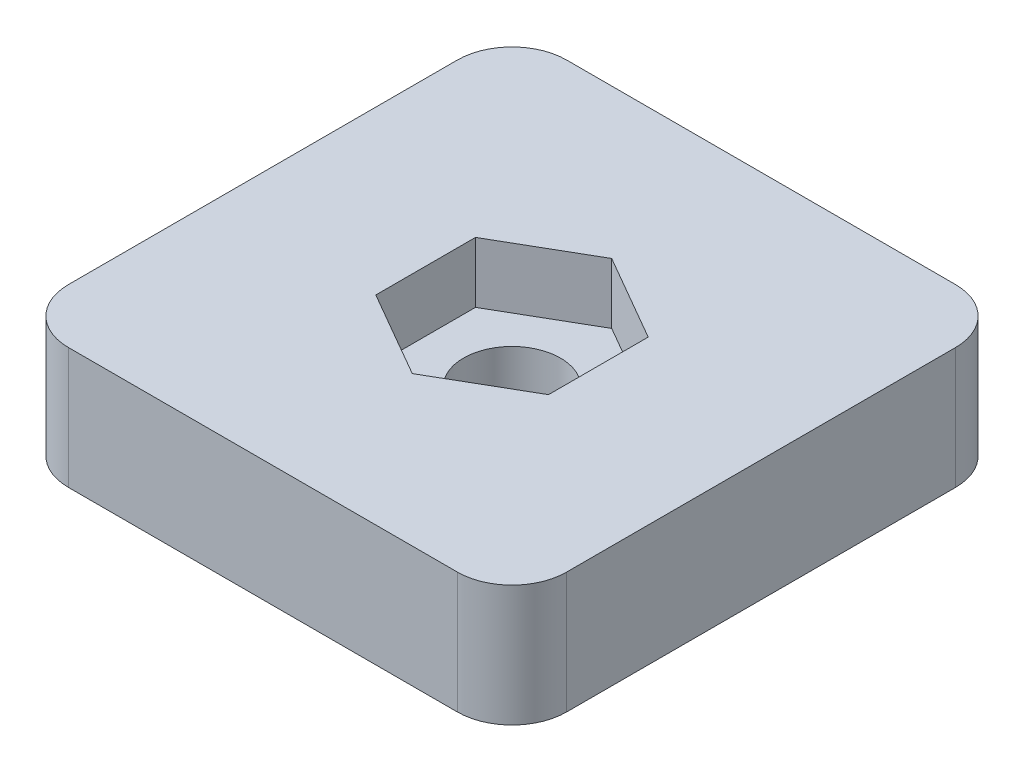
ISO-10303-21;
HEADER;
FILE_DESCRIPTION(('STEP AP214'),'2;1');
FILE_NAME('part.step','',(''),(''),'','','');
FILE_SCHEMA(('AUTOMOTIVE_DESIGN { 1 0 10303 214 1 1 1 1 }'));
ENDSEC;
DATA;
#1=APPLICATION_CONTEXT('core data for automotive mechanical design processes');
#2=APPLICATION_PROTOCOL_DEFINITION('international standard','automotive_design',2000,#1);
#3=PRODUCT_CONTEXT('',#1,'mechanical');
#4=PRODUCT('Part','Part','',(#3));
#5=PRODUCT_RELATED_PRODUCT_CATEGORY('part','',(#4));
#6=PRODUCT_DEFINITION_FORMATION('','',#4);
#7=PRODUCT_DEFINITION_CONTEXT('part definition',#1,'design');
#8=PRODUCT_DEFINITION('design','',#6,#7);
#9=PRODUCT_DEFINITION_SHAPE('','',#8);
#10=(LENGTH_UNIT() NAMED_UNIT(*) SI_UNIT(.MILLI.,.METRE.));
#11=(NAMED_UNIT(*) PLANE_ANGLE_UNIT() SI_UNIT($,.RADIAN.));
#12=(NAMED_UNIT(*) SI_UNIT($,.STERADIAN.) SOLID_ANGLE_UNIT());
#13=UNCERTAINTY_MEASURE_WITH_UNIT(LENGTH_MEASURE(1.E-05),#10,'distance_accuracy_value','');
#14=(GEOMETRIC_REPRESENTATION_CONTEXT(3) GLOBAL_UNCERTAINTY_ASSIGNED_CONTEXT((#13)) GLOBAL_UNIT_ASSIGNED_CONTEXT((#10,
#11,#12)) REPRESENTATION_CONTEXT('',''));
#15=CARTESIAN_POINT('',(0.,0.,0.));
#16=DIRECTION('',(0.,0.,1.));
#17=DIRECTION('',(1.,0.,0.));
#18=AXIS2_PLACEMENT_3D('',#15,#16,#17);
#19=CARTESIAN_POINT('',(-1.425,2.,2.46817240078565));
#20=DIRECTION('',(0.5,0.,-0.866025403784439));
#21=DIRECTION('',(-0.866025403784439,0.,-0.5));
#22=AXIS2_PLACEMENT_3D('',#19,#20,#21);
#23=PLANE('',#22);
#24=DIRECTION('',(0.866025403784439,0.,0.5));
#25=VECTOR('',#24,1.);
#26=CARTESIAN_POINT('',(-1.425,0.,2.46817240078565));
#27=LINE('',#26,#25);
#28=CARTESIAN_POINT('',(-2.85,0.,1.64544826719043));
#29=VERTEX_POINT('',#28);
#30=CARTESIAN_POINT('',(0.,0.,3.29089653438087));
#31=VERTEX_POINT('',#30);
#32=EDGE_CURVE('E153',#29,#31,#27,.T.);
#33=ORIENTED_EDGE('',*,*,#32,.F.);
#34=DIRECTION('',(0.,-1.,0.));
#35=VECTOR('',#34,1.);
#36=CARTESIAN_POINT('',(-2.85,2.,1.64544826719043));
#37=LINE('',#36,#35);
#38=CARTESIAN_POINT('',(-2.85,2.,1.64544826719043));
#39=VERTEX_POINT('',#38);
#40=EDGE_CURVE('E11',#39,#29,#37,.T.);
#41=ORIENTED_EDGE('',*,*,#40,.F.);
#42=DIRECTION('',(0.866025403784439,0.,0.5));
#43=VECTOR('',#42,1.);
#44=CARTESIAN_POINT('',(-1.425,2.,2.46817240078565));
#45=LINE('',#44,#43);
#46=CARTESIAN_POINT('',(0.,2.,3.29089653438087));
#47=VERTEX_POINT('',#46);
#48=EDGE_CURVE('E256',#39,#47,#45,.T.);
#49=ORIENTED_EDGE('',*,*,#48,.T.);
#50=DIRECTION('',(0.,-1.,0.));
#51=VECTOR('',#50,1.);
#52=CARTESIAN_POINT('',(0.,2.,3.29089653438087));
#53=LINE('',#52,#51);
#54=EDGE_CURVE('E58',#47,#31,#53,.T.);
#55=ORIENTED_EDGE('',*,*,#54,.T.);
#56=EDGE_LOOP('',(#33,#41,#49,#55));
#57=FACE_BOUND('',#56,.T.);
#58=ADVANCED_FACE('F39',(#57),#23,.T.);
#59=CARTESIAN_POINT('',(-2.85,2.,0.));
#60=DIRECTION('',(1.,0.,0.));
#61=DIRECTION('',(0.,0.,-1.));
#62=AXIS2_PLACEMENT_3D('',#59,#60,#61);
#63=PLANE('',#62);
#64=DIRECTION('',(0.,0.,1.));
#65=VECTOR('',#64,1.);
#66=CARTESIAN_POINT('',(-2.85,0.,0.));
#67=LINE('',#66,#65);
#68=CARTESIAN_POINT('',(-2.85,0.,-1.64544826719043));
#69=VERTEX_POINT('',#68);
#70=EDGE_CURVE('E156',#69,#29,#67,.T.);
#71=ORIENTED_EDGE('',*,*,#70,.F.);
#72=DIRECTION('',(0.,-1.,0.));
#73=VECTOR('',#72,1.);
#74=CARTESIAN_POINT('',(-2.85,2.,-1.64544826719043));
#75=LINE('',#74,#73);
#76=CARTESIAN_POINT('',(-2.85,2.,-1.64544826719043));
#77=VERTEX_POINT('',#76);
#78=EDGE_CURVE('E49',#77,#69,#75,.T.);
#79=ORIENTED_EDGE('',*,*,#78,.F.);
#80=DIRECTION('',(0.,0.,1.));
#81=VECTOR('',#80,1.);
#82=CARTESIAN_POINT('',(-2.85,2.,0.));
#83=LINE('',#82,#81);
#84=EDGE_CURVE('E258',#77,#39,#83,.T.);
#85=ORIENTED_EDGE('',*,*,#84,.T.);
#86=ORIENTED_EDGE('',*,*,#40,.T.);
#87=EDGE_LOOP('',(#71,#79,#85,#86));
#88=FACE_BOUND('',#87,.T.);
#89=ADVANCED_FACE('F269',(#88),#63,.T.);
#90=CARTESIAN_POINT('',(-1.425,2.,-2.46817240078565));
#91=DIRECTION('',(0.5,0.,0.866025403784439));
#92=DIRECTION('',(0.866025403784439,0.,-0.5));
#93=AXIS2_PLACEMENT_3D('',#90,#91,#92);
#94=PLANE('',#93);
#95=DIRECTION('',(-0.866025403784439,0.,0.5));
#96=VECTOR('',#95,1.);
#97=CARTESIAN_POINT('',(-1.425,0.,-2.46817240078565));
#98=LINE('',#97,#96);
#99=CARTESIAN_POINT('',(0.,0.,-3.29089653438087));
#100=VERTEX_POINT('',#99);
#101=EDGE_CURVE('E160',#100,#69,#98,.T.);
#102=ORIENTED_EDGE('',*,*,#101,.F.);
#103=DIRECTION('',(0.,-1.,0.));
#104=VECTOR('',#103,1.);
#105=CARTESIAN_POINT('',(0.,2.,-3.29089653438087));
#106=LINE('',#105,#104);
#107=CARTESIAN_POINT('',(0.,2.,-3.29089653438087));
#108=VERTEX_POINT('',#107);
#109=EDGE_CURVE('E131',#108,#100,#106,.T.);
#110=ORIENTED_EDGE('',*,*,#109,.F.);
#111=DIRECTION('',(-0.866025403784439,0.,0.5));
#112=VECTOR('',#111,1.);
#113=CARTESIAN_POINT('',(-1.425,2.,-2.46817240078565));
#114=LINE('',#113,#112);
#115=EDGE_CURVE('E143',#108,#77,#114,.T.);
#116=ORIENTED_EDGE('',*,*,#115,.T.);
#117=ORIENTED_EDGE('',*,*,#78,.T.);
#118=EDGE_LOOP('',(#102,#110,#116,#117));
#119=FACE_BOUND('',#118,.T.);
#120=ADVANCED_FACE('F262',(#119),#94,.T.);
#121=CARTESIAN_POINT('',(1.425,2.,-2.46817240078565));
#122=DIRECTION('',(-0.5,0.,0.866025403784439));
#123=DIRECTION('',(0.866025403784439,0.,0.5));
#124=AXIS2_PLACEMENT_3D('',#121,#122,#123);
#125=PLANE('',#124);
#126=DIRECTION('',(-0.866025403784439,0.,-0.5));
#127=VECTOR('',#126,1.);
#128=CARTESIAN_POINT('',(1.425,0.,-2.46817240078565));
#129=LINE('',#128,#127);
#130=CARTESIAN_POINT('',(2.85,0.,-1.64544826719043));
#131=VERTEX_POINT('',#130);
#132=EDGE_CURVE('E129',#131,#100,#129,.T.);
#133=ORIENTED_EDGE('',*,*,#132,.F.);
#134=DIRECTION('',(0.,-1.,0.));
#135=VECTOR('',#134,1.);
#136=CARTESIAN_POINT('',(2.85,2.,-1.64544826719043));
#137=LINE('',#136,#135);
#138=CARTESIAN_POINT('',(2.85,2.,-1.64544826719043));
#139=VERTEX_POINT('',#138);
#140=EDGE_CURVE('E79',#139,#131,#137,.T.);
#141=ORIENTED_EDGE('',*,*,#140,.F.);
#142=DIRECTION('',(-0.866025403784439,0.,-0.5));
#143=VECTOR('',#142,1.);
#144=CARTESIAN_POINT('',(1.425,2.,-2.46817240078565));
#145=LINE('',#144,#143);
#146=EDGE_CURVE('E127',#139,#108,#145,.T.);
#147=ORIENTED_EDGE('',*,*,#146,.T.);
#148=ORIENTED_EDGE('',*,*,#109,.T.);
#149=EDGE_LOOP('',(#133,#141,#147,#148));
#150=FACE_BOUND('',#149,.T.);
#151=ADVANCED_FACE('F126',(#150),#125,.T.);
#152=CARTESIAN_POINT('',(2.85,2.,0.));
#153=DIRECTION('',(-1.,0.,0.));
#154=DIRECTION('',(0.,0.,1.));
#155=AXIS2_PLACEMENT_3D('',#152,#153,#154);
#156=PLANE('',#155);
#157=DIRECTION('',(0.,0.,-1.));
#158=VECTOR('',#157,1.);
#159=CARTESIAN_POINT('',(2.85,0.,0.));
#160=LINE('',#159,#158);
#161=CARTESIAN_POINT('',(2.85,0.,1.64544826719043));
#162=VERTEX_POINT('',#161);
#163=EDGE_CURVE('E164',#162,#131,#160,.T.);
#164=ORIENTED_EDGE('',*,*,#163,.F.);
#165=DIRECTION('',(0.,-1.,0.));
#166=VECTOR('',#165,1.);
#167=CARTESIAN_POINT('',(2.85,2.,1.64544826719043));
#168=LINE('',#167,#166);
#169=CARTESIAN_POINT('',(2.85,2.,1.64544826719043));
#170=VERTEX_POINT('',#169);
#171=EDGE_CURVE('E132',#170,#162,#168,.T.);
#172=ORIENTED_EDGE('',*,*,#171,.F.);
#173=DIRECTION('',(0.,0.,-1.));
#174=VECTOR('',#173,1.);
#175=CARTESIAN_POINT('',(2.85,2.,0.));
#176=LINE('',#175,#174);
#177=EDGE_CURVE('E140',#170,#139,#176,.T.);
#178=ORIENTED_EDGE('',*,*,#177,.T.);
#179=ORIENTED_EDGE('',*,*,#140,.T.);
#180=EDGE_LOOP('',(#164,#172,#178,#179));
#181=FACE_BOUND('',#180,.T.);
#182=ADVANCED_FACE('F145',(#181),#156,.T.);
#183=CARTESIAN_POINT('',(-6.42,2.,6.42));
#184=DIRECTION('',(0.,-1.,0.));
#185=DIRECTION('',(0.,0.,-1.));
#186=AXIS2_PLACEMENT_3D('',#183,#184,#185);
#187=CYLINDRICAL_SURFACE('',#186,1.8);
#188=DIRECTION('',(0.,-1.,0.));
#189=VECTOR('',#188,1.);
#190=CARTESIAN_POINT('',(-8.22,2.,6.42));
#191=LINE('',#190,#189);
#192=CARTESIAN_POINT('',(-8.22,2.,6.42));
#193=VERTEX_POINT('',#192);
#194=CARTESIAN_POINT('',(-8.22,-2.,6.42));
#195=VERTEX_POINT('',#194);
#196=EDGE_CURVE('E149',#193,#195,#191,.T.);
#197=ORIENTED_EDGE('',*,*,#196,.T.);
#198=CARTESIAN_POINT('',(-6.42,-2.,6.42));
#199=DIRECTION('',(0.,1.,0.));
#200=DIRECTION('',(0.,0.,1.));
#201=AXIS2_PLACEMENT_3D('',#198,#199,#200);
#202=CIRCLE('',#201,1.8);
#203=CARTESIAN_POINT('',(-6.42,-2.,8.22));
#204=VERTEX_POINT('',#203);
#205=EDGE_CURVE('E208',#204,#195,#202,.F.);
#206=ORIENTED_EDGE('',*,*,#205,.F.);
#207=DIRECTION('',(0.,-1.,0.));
#208=VECTOR('',#207,1.);
#209=CARTESIAN_POINT('',(-6.42,2.,8.22));
#210=LINE('',#209,#208);
#211=CARTESIAN_POINT('',(-6.42,2.,8.22));
#212=VERTEX_POINT('',#211);
#213=EDGE_CURVE('E43',#212,#204,#210,.T.);
#214=ORIENTED_EDGE('',*,*,#213,.F.);
#215=CARTESIAN_POINT('',(-6.42,2.,6.42));
#216=DIRECTION('',(0.,1.,0.));
#217=DIRECTION('',(0.,0.,1.));
#218=AXIS2_PLACEMENT_3D('',#215,#216,#217);
#219=CIRCLE('',#218,1.8);
#220=EDGE_CURVE('E169',#212,#193,#219,.F.);
#221=ORIENTED_EDGE('',*,*,#220,.T.);
#222=EDGE_LOOP('',(#197,#206,#214,#221));
#223=FACE_BOUND('',#222,.T.);
#224=ADVANCED_FACE('F41',(#223),#187,.T.);
#225=CARTESIAN_POINT('',(0.,2.,8.22));
#226=DIRECTION('',(0.,0.,-1.));
#227=DIRECTION('',(-1.,0.,0.));
#228=AXIS2_PLACEMENT_3D('',#225,#226,#227);
#229=PLANE('',#228);
#230=ORIENTED_EDGE('',*,*,#213,.T.);
#231=DIRECTION('',(1.,0.,0.));
#232=VECTOR('',#231,1.);
#233=CARTESIAN_POINT('',(0.,-2.,8.22));
#234=LINE('',#233,#232);
#235=CARTESIAN_POINT('',(6.41999999999999,-2.,8.22));
#236=VERTEX_POINT('',#235);
#237=EDGE_CURVE('E203',#204,#236,#234,.T.);
#238=ORIENTED_EDGE('',*,*,#237,.T.);
#239=DIRECTION('',(0.,-1.,0.));
#240=VECTOR('',#239,1.);
#241=CARTESIAN_POINT('',(6.41999999999999,2.,8.22));
#242=LINE('',#241,#240);
#243=CARTESIAN_POINT('',(6.41999999999999,2.,8.22));
#244=VERTEX_POINT('',#243);
#245=EDGE_CURVE('E190',#244,#236,#242,.T.);
#246=ORIENTED_EDGE('',*,*,#245,.F.);
#247=DIRECTION('',(1.,0.,0.));
#248=VECTOR('',#247,1.);
#249=CARTESIAN_POINT('',(0.,2.,8.22));
#250=LINE('',#249,#248);
#251=EDGE_CURVE('E204',#212,#244,#250,.T.);
#252=ORIENTED_EDGE('',*,*,#251,.F.);
#253=EDGE_LOOP('',(#230,#238,#246,#252));
#254=FACE_BOUND('',#253,.T.);
#255=ADVANCED_FACE('F201',(#254),#229,.F.);
#256=CARTESIAN_POINT('',(6.42,2.,6.42));
#257=DIRECTION('',(0.,-1.,0.));
#258=DIRECTION('',(0.,0.,-1.));
#259=AXIS2_PLACEMENT_3D('',#256,#257,#258);
#260=CYLINDRICAL_SURFACE('',#259,1.8);
#261=ORIENTED_EDGE('',*,*,#245,.T.);
#262=CARTESIAN_POINT('',(6.42,-2.,6.42));
#263=DIRECTION('',(0.,1.,0.));
#264=DIRECTION('',(0.,0.,1.));
#265=AXIS2_PLACEMENT_3D('',#262,#263,#264);
#266=CIRCLE('',#265,1.8);
#267=CARTESIAN_POINT('',(8.22,-2.,6.41999999999998));
#268=VERTEX_POINT('',#267);
#269=EDGE_CURVE('E218',#236,#268,#266,.T.);
#270=ORIENTED_EDGE('',*,*,#269,.T.);
#271=DIRECTION('',(0.,-1.,0.));
#272=VECTOR('',#271,1.);
#273=CARTESIAN_POINT('',(8.22,2.,6.41999999999998));
#274=LINE('',#273,#272);
#275=CARTESIAN_POINT('',(8.22,2.,6.41999999999998));
#276=VERTEX_POINT('',#275);
#277=EDGE_CURVE('E188',#276,#268,#274,.T.);
#278=ORIENTED_EDGE('',*,*,#277,.F.);
#279=CARTESIAN_POINT('',(6.42,2.,6.42));
#280=DIRECTION('',(0.,1.,0.));
#281=DIRECTION('',(0.,0.,1.));
#282=AXIS2_PLACEMENT_3D('',#279,#280,#281);
#283=CIRCLE('',#282,1.8);
#284=EDGE_CURVE('E242',#244,#276,#283,.T.);
#285=ORIENTED_EDGE('',*,*,#284,.F.);
#286=EDGE_LOOP('',(#261,#270,#278,#285));
#287=FACE_BOUND('',#286,.T.);
#288=ADVANCED_FACE('F297',(#287),#260,.T.);
#289=CARTESIAN_POINT('',(8.22,2.,0.));
#290=DIRECTION('',(-1.,0.,0.));
#291=DIRECTION('',(0.,0.,1.));
#292=AXIS2_PLACEMENT_3D('',#289,#290,#291);
#293=PLANE('',#292);
#294=ORIENTED_EDGE('',*,*,#277,.T.);
#295=DIRECTION('',(0.,0.,-1.));
#296=VECTOR('',#295,1.);
#297=CARTESIAN_POINT('',(8.22,-2.,0.));
#298=LINE('',#297,#296);
#299=CARTESIAN_POINT('',(8.22,-2.,-6.41999999999999));
#300=VERTEX_POINT('',#299);
#301=EDGE_CURVE('E220',#268,#300,#298,.T.);
#302=ORIENTED_EDGE('',*,*,#301,.T.);
#303=DIRECTION('',(0.,-1.,0.));
#304=VECTOR('',#303,1.);
#305=CARTESIAN_POINT('',(8.22,2.,-6.41999999999999));
#306=LINE('',#305,#304);
#307=CARTESIAN_POINT('',(8.22,2.,-6.41999999999999));
#308=VERTEX_POINT('',#307);
#309=EDGE_CURVE('E185',#308,#300,#306,.T.);
#310=ORIENTED_EDGE('',*,*,#309,.F.);
#311=DIRECTION('',(0.,0.,-1.));
#312=VECTOR('',#311,1.);
#313=CARTESIAN_POINT('',(8.22,2.,0.));
#314=LINE('',#313,#312);
#315=EDGE_CURVE('E244',#276,#308,#314,.T.);
#316=ORIENTED_EDGE('',*,*,#315,.F.);
#317=EDGE_LOOP('',(#294,#302,#310,#316));
#318=FACE_BOUND('',#317,.T.);
#319=ADVANCED_FACE('F293',(#318),#293,.F.);
#320=CARTESIAN_POINT('',(6.42,2.,-6.42));
#321=DIRECTION('',(0.,-1.,0.));
#322=DIRECTION('',(0.,0.,-1.));
#323=AXIS2_PLACEMENT_3D('',#320,#321,#322);
#324=CYLINDRICAL_SURFACE('',#323,1.8);
#325=ORIENTED_EDGE('',*,*,#309,.T.);
#326=CARTESIAN_POINT('',(6.42,-2.,-6.42));
#327=DIRECTION('',(0.,1.,0.));
#328=DIRECTION('',(0.,0.,1.));
#329=AXIS2_PLACEMENT_3D('',#326,#327,#328);
#330=CIRCLE('',#329,1.8);
#331=CARTESIAN_POINT('',(6.41999999999998,-2.,-8.22));
#332=VERTEX_POINT('',#331);
#333=EDGE_CURVE('E225',#300,#332,#330,.T.);
#334=ORIENTED_EDGE('',*,*,#333,.T.);
#335=DIRECTION('',(0.,-1.,0.));
#336=VECTOR('',#335,1.);
#337=CARTESIAN_POINT('',(6.41999999999998,2.,-8.22));
#338=LINE('',#337,#336);
#339=CARTESIAN_POINT('',(6.41999999999998,2.,-8.22));
#340=VERTEX_POINT('',#339);
#341=EDGE_CURVE('E182',#340,#332,#338,.T.);
#342=ORIENTED_EDGE('',*,*,#341,.F.);
#343=CARTESIAN_POINT('',(6.42,2.,-6.42));
#344=DIRECTION('',(0.,1.,0.));
#345=DIRECTION('',(0.,0.,1.));
#346=AXIS2_PLACEMENT_3D('',#343,#344,#345);
#347=CIRCLE('',#346,1.8);
#348=EDGE_CURVE('E246',#308,#340,#347,.T.);
#349=ORIENTED_EDGE('',*,*,#348,.F.);
#350=EDGE_LOOP('',(#325,#334,#342,#349));
#351=FACE_BOUND('',#350,.T.);
#352=ADVANCED_FACE('F289',(#351),#324,.T.);
#353=CARTESIAN_POINT('',(0.,2.,-8.22));
#354=DIRECTION('',(0.,0.,-1.));
#355=DIRECTION('',(-1.,0.,0.));
#356=AXIS2_PLACEMENT_3D('',#353,#354,#355);
#357=PLANE('',#356);
#358=ORIENTED_EDGE('',*,*,#341,.T.);
#359=DIRECTION('',(1.,0.,0.));
#360=VECTOR('',#359,1.);
#361=CARTESIAN_POINT('',(0.,-2.,-8.22));
#362=LINE('',#361,#360);
#363=CARTESIAN_POINT('',(-6.41999999999999,-2.,-8.22));
#364=VERTEX_POINT('',#363);
#365=EDGE_CURVE('E228',#364,#332,#362,.T.);
#366=ORIENTED_EDGE('',*,*,#365,.F.);
#367=DIRECTION('',(0.,-1.,0.));
#368=VECTOR('',#367,1.);
#369=CARTESIAN_POINT('',(-6.41999999999999,2.,-8.22));
#370=LINE('',#369,#368);
#371=CARTESIAN_POINT('',(-6.41999999999999,2.,-8.22));
#372=VERTEX_POINT('',#371);
#373=EDGE_CURVE('E179',#372,#364,#370,.T.);
#374=ORIENTED_EDGE('',*,*,#373,.F.);
#375=DIRECTION('',(1.,0.,0.));
#376=VECTOR('',#375,1.);
#377=CARTESIAN_POINT('',(0.,2.,-8.22));
#378=LINE('',#377,#376);
#379=EDGE_CURVE('E248',#372,#340,#378,.T.);
#380=ORIENTED_EDGE('',*,*,#379,.T.);
#381=EDGE_LOOP('',(#358,#366,#374,#380));
#382=FACE_BOUND('',#381,.T.);
#383=ADVANCED_FACE('F285',(#382),#357,.T.);
#384=CARTESIAN_POINT('',(-6.42,2.,-6.42));
#385=DIRECTION('',(0.,-1.,0.));
#386=DIRECTION('',(0.,0.,-1.));
#387=AXIS2_PLACEMENT_3D('',#384,#385,#386);
#388=CYLINDRICAL_SURFACE('',#387,1.8);
#389=ORIENTED_EDGE('',*,*,#373,.T.);
#390=CARTESIAN_POINT('',(-6.42,-2.,-6.42));
#391=DIRECTION('',(0.,1.,0.));
#392=DIRECTION('',(0.,0.,1.));
#393=AXIS2_PLACEMENT_3D('',#390,#391,#392);
#394=CIRCLE('',#393,1.8);
#395=CARTESIAN_POINT('',(-8.22,-2.,-6.42));
#396=VERTEX_POINT('',#395);
#397=EDGE_CURVE('E231',#364,#396,#394,.T.);
#398=ORIENTED_EDGE('',*,*,#397,.T.);
#399=DIRECTION('',(0.,-1.,0.));
#400=VECTOR('',#399,1.);
#401=CARTESIAN_POINT('',(-8.22,2.,-6.42));
#402=LINE('',#401,#400);
#403=CARTESIAN_POINT('',(-8.22,2.,-6.42));
#404=VERTEX_POINT('',#403);
#405=EDGE_CURVE('E176',#404,#396,#402,.T.);
#406=ORIENTED_EDGE('',*,*,#405,.F.);
#407=CARTESIAN_POINT('',(-6.42,2.,-6.42));
#408=DIRECTION('',(0.,1.,0.));
#409=DIRECTION('',(0.,0.,1.));
#410=AXIS2_PLACEMENT_3D('',#407,#408,#409);
#411=CIRCLE('',#410,1.8);
#412=EDGE_CURVE('E251',#372,#404,#411,.T.);
#413=ORIENTED_EDGE('',*,*,#412,.F.);
#414=EDGE_LOOP('',(#389,#398,#406,#413));
#415=FACE_BOUND('',#414,.T.);
#416=ADVANCED_FACE('F281',(#415),#388,.T.);
#417=CARTESIAN_POINT('',(-8.22,2.,0.));
#418=DIRECTION('',(-1.,0.,0.));
#419=DIRECTION('',(0.,0.,1.));
#420=AXIS2_PLACEMENT_3D('',#417,#418,#419);
#421=PLANE('',#420);
#422=ORIENTED_EDGE('',*,*,#405,.T.);
#423=DIRECTION('',(0.,0.,-1.));
#424=VECTOR('',#423,1.);
#425=CARTESIAN_POINT('',(-8.22,-2.,0.));
#426=LINE('',#425,#424);
#427=EDGE_CURVE('E234',#195,#396,#426,.T.);
#428=ORIENTED_EDGE('',*,*,#427,.F.);
#429=ORIENTED_EDGE('',*,*,#196,.F.);
#430=DIRECTION('',(0.,0.,-1.));
#431=VECTOR('',#430,1.);
#432=CARTESIAN_POINT('',(-8.22,2.,0.));
#433=LINE('',#432,#431);
#434=EDGE_CURVE('E253',#193,#404,#433,.T.);
#435=ORIENTED_EDGE('',*,*,#434,.T.);
#436=EDGE_LOOP('',(#422,#428,#429,#435));
#437=FACE_BOUND('',#436,.T.);
#438=ADVANCED_FACE('F278',(#437),#421,.T.);
#439=CARTESIAN_POINT('',(1.425,2.,2.46817240078565));
#440=DIRECTION('',(-0.5,0.,-0.866025403784439));
#441=DIRECTION('',(-0.866025403784439,0.,0.5));
#442=AXIS2_PLACEMENT_3D('',#439,#440,#441);
#443=PLANE('',#442);
#444=DIRECTION('',(0.866025403784439,0.,-0.5));
#445=VECTOR('',#444,1.);
#446=CARTESIAN_POINT('',(1.425,0.,2.46817240078565));
#447=LINE('',#446,#445);
#448=EDGE_CURVE('E166',#31,#162,#447,.T.);
#449=ORIENTED_EDGE('',*,*,#448,.F.);
#450=ORIENTED_EDGE('',*,*,#54,.F.);
#451=DIRECTION('',(0.866025403784439,0.,-0.5));
#452=VECTOR('',#451,1.);
#453=CARTESIAN_POINT('',(1.425,2.,2.46817240078565));
#454=LINE('',#453,#452);
#455=EDGE_CURVE('E147',#47,#170,#454,.T.);
#456=ORIENTED_EDGE('',*,*,#455,.T.);
#457=ORIENTED_EDGE('',*,*,#171,.T.);
#458=EDGE_LOOP('',(#449,#450,#456,#457));
#459=FACE_BOUND('',#458,.T.);
#460=ADVANCED_FACE('F267',(#459),#443,.T.);
#461=CARTESIAN_POINT('',(0.,2.,0.));
#462=DIRECTION('',(0.,1.,0.));
#463=DIRECTION('',(0.,0.,1.));
#464=AXIS2_PLACEMENT_3D('',#461,#462,#463);
#465=PLANE('',#464);
#466=ORIENTED_EDGE('',*,*,#220,.F.);
#467=ORIENTED_EDGE('',*,*,#251,.T.);
#468=ORIENTED_EDGE('',*,*,#284,.T.);
#469=ORIENTED_EDGE('',*,*,#315,.T.);
#470=ORIENTED_EDGE('',*,*,#348,.T.);
#471=ORIENTED_EDGE('',*,*,#379,.F.);
#472=ORIENTED_EDGE('',*,*,#412,.T.);
#473=ORIENTED_EDGE('',*,*,#434,.F.);
#474=EDGE_LOOP('',(#466,#467,#468,#469,#470,#471,#472,#473));
#475=FACE_BOUND('',#474,.T.);
#476=ORIENTED_EDGE('',*,*,#48,.F.);
#477=ORIENTED_EDGE('',*,*,#84,.F.);
#478=ORIENTED_EDGE('',*,*,#115,.F.);
#479=ORIENTED_EDGE('',*,*,#146,.F.);
#480=ORIENTED_EDGE('',*,*,#177,.F.);
#481=ORIENTED_EDGE('',*,*,#455,.F.);
#482=EDGE_LOOP('',(#476,#477,#478,#479,#480,#481));
#483=FACE_BOUND('',#482,.T.);
#484=ADVANCED_FACE('F138',(#475,#483),#465,.T.);
#485=CARTESIAN_POINT('',(0.,-2.,0.));
#486=DIRECTION('',(0.,1.,0.));
#487=DIRECTION('',(0.,0.,1.));
#488=AXIS2_PLACEMENT_3D('',#485,#486,#487);
#489=CYLINDRICAL_SURFACE('',#488,1.6);
#490=CARTESIAN_POINT('',(0.,-2.,0.));
#491=DIRECTION('',(0.,1.,0.));
#492=DIRECTION('',(0.,0.,1.));
#493=AXIS2_PLACEMENT_3D('',#490,#491,#492);
#494=CIRCLE('',#493,1.6);
#495=CARTESIAN_POINT('',(0.,-2.,1.6));
#496=VERTEX_POINT('',#495);
#497=EDGE_CURVE('E157',#496,#496,#494,.T.);
#498=ORIENTED_EDGE('',*,*,#497,.F.);
#499=EDGE_LOOP('',(#498));
#500=FACE_BOUND('',#499,.T.);
#501=CARTESIAN_POINT('',(0.,0.,0.));
#502=DIRECTION('',(0.,1.,0.));
#503=DIRECTION('',(0.,0.,1.));
#504=AXIS2_PLACEMENT_3D('',#501,#502,#503);
#505=CIRCLE('',#504,1.6);
#506=CARTESIAN_POINT('',(0.,0.,1.6));
#507=VERTEX_POINT('',#506);
#508=EDGE_CURVE('E213',#507,#507,#505,.T.);
#509=ORIENTED_EDGE('',*,*,#508,.T.);
#510=EDGE_LOOP('',(#509));
#511=FACE_BOUND('',#510,.T.);
#512=ADVANCED_FACE('F394',(#500,#511),#489,.F.);
#513=CARTESIAN_POINT('',(0.,-2.,0.));
#514=DIRECTION('',(0.,1.,0.));
#515=DIRECTION('',(0.,0.,1.));
#516=AXIS2_PLACEMENT_3D('',#513,#514,#515);
#517=PLANE('',#516);
#518=ORIENTED_EDGE('',*,*,#205,.T.);
#519=ORIENTED_EDGE('',*,*,#427,.T.);
#520=ORIENTED_EDGE('',*,*,#397,.F.);
#521=ORIENTED_EDGE('',*,*,#365,.T.);
#522=ORIENTED_EDGE('',*,*,#333,.F.);
#523=ORIENTED_EDGE('',*,*,#301,.F.);
#524=ORIENTED_EDGE('',*,*,#269,.F.);
#525=ORIENTED_EDGE('',*,*,#237,.F.);
#526=EDGE_LOOP('',(#518,#519,#520,#521,#522,#523,#524,#525));
#527=FACE_BOUND('',#526,.T.);
#528=ORIENTED_EDGE('',*,*,#497,.T.);
#529=EDGE_LOOP('',(#528));
#530=FACE_BOUND('',#529,.T.);
#531=ADVANCED_FACE('F215',(#527,#530),#517,.F.);
#532=CARTESIAN_POINT('',(0.,0.,0.));
#533=DIRECTION('',(0.,1.,0.));
#534=DIRECTION('',(0.,0.,1.));
#535=AXIS2_PLACEMENT_3D('',#532,#533,#534);
#536=PLANE('',#535);
#537=ORIENTED_EDGE('',*,*,#70,.T.);
#538=ORIENTED_EDGE('',*,*,#32,.T.);
#539=ORIENTED_EDGE('',*,*,#448,.T.);
#540=ORIENTED_EDGE('',*,*,#163,.T.);
#541=ORIENTED_EDGE('',*,*,#132,.T.);
#542=ORIENTED_EDGE('',*,*,#101,.T.);
#543=EDGE_LOOP('',(#537,#538,#539,#540,#541,#542));
#544=FACE_BOUND('',#543,.T.);
#545=ORIENTED_EDGE('',*,*,#508,.F.);
#546=EDGE_LOOP('',(#545));
#547=FACE_BOUND('',#546,.T.);
#548=ADVANCED_FACE('F265',(#544,#547),#536,.T.);
#549=CLOSED_SHELL('',(#58,#89,#120,#151,#182,#224,#255,#288,#319,#352,#383,#416,#438,#460,#484,
#512,#531,#548));
#550=MANIFOLD_SOLID_BREP('B2',#549);
#551=ADVANCED_BREP_SHAPE_REPRESENTATION('',(#18,#550),#14);
#552=SHAPE_DEFINITION_REPRESENTATION(#9,#551);
ENDSEC;
END-ISO-10303-21;
